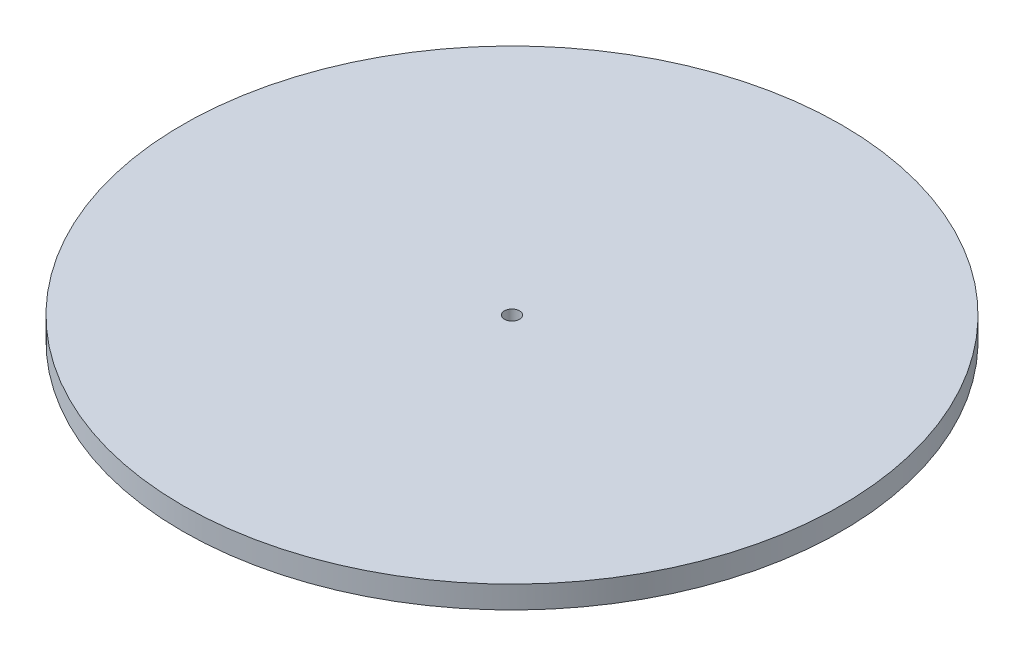
ISO-10303-21;
HEADER;
FILE_DESCRIPTION(('STEP AP214'),'2;1');
FILE_NAME('part.step','',(''),(''),'','','');
FILE_SCHEMA(('AUTOMOTIVE_DESIGN { 1 0 10303 214 1 1 1 1 }'));
ENDSEC;
DATA;
#1=APPLICATION_CONTEXT('core data for automotive mechanical design processes');
#2=APPLICATION_PROTOCOL_DEFINITION('international standard','automotive_design',2000,#1);
#3=PRODUCT_CONTEXT('',#1,'mechanical');
#4=PRODUCT('Part','Part','',(#3));
#5=PRODUCT_RELATED_PRODUCT_CATEGORY('part','',(#4));
#6=PRODUCT_DEFINITION_FORMATION('','',#4);
#7=PRODUCT_DEFINITION_CONTEXT('part definition',#1,'design');
#8=PRODUCT_DEFINITION('design','',#6,#7);
#9=PRODUCT_DEFINITION_SHAPE('','',#8);
#10=(LENGTH_UNIT() NAMED_UNIT(*) SI_UNIT(.MILLI.,.METRE.));
#11=(NAMED_UNIT(*) PLANE_ANGLE_UNIT() SI_UNIT($,.RADIAN.));
#12=(NAMED_UNIT(*) SI_UNIT($,.STERADIAN.) SOLID_ANGLE_UNIT());
#13=UNCERTAINTY_MEASURE_WITH_UNIT(LENGTH_MEASURE(1.E-05),#10,'distance_accuracy_value','');
#14=(GEOMETRIC_REPRESENTATION_CONTEXT(3) GLOBAL_UNCERTAINTY_ASSIGNED_CONTEXT((#13)) GLOBAL_UNIT_ASSIGNED_CONTEXT((#10,
#11,#12)) REPRESENTATION_CONTEXT('',''));
#15=CARTESIAN_POINT('',(0.,0.,0.));
#16=DIRECTION('',(0.,0.,1.));
#17=DIRECTION('',(1.,0.,0.));
#18=AXIS2_PLACEMENT_3D('',#15,#16,#17);
#19=CARTESIAN_POINT('',(0.,19.05,0.));
#20=DIRECTION('',(0.,-1.,0.));
#21=DIRECTION('',(0.,0.,-1.));
#22=AXIS2_PLACEMENT_3D('',#19,#20,#21);
#23=CYLINDRICAL_SURFACE('',#22,279.945595429);
#24=CARTESIAN_POINT('',(0.,19.05,0.));
#25=DIRECTION('',(0.,1.,0.));
#26=DIRECTION('',(0.,0.,1.));
#27=AXIS2_PLACEMENT_3D('',#24,#25,#26);
#28=CIRCLE('',#27,279.945595429);
#29=CARTESIAN_POINT('',(0.,19.05,-279.945595429));
#30=VERTEX_POINT('',#29);
#31=EDGE_CURVE('E10',#30,#30,#28,.T.);
#32=CARTESIAN_POINT('',(0.,0.,0.));
#33=DIRECTION('',(0.,1.,0.));
#34=DIRECTION('',(0.,0.,1.));
#35=AXIS2_PLACEMENT_3D('',#32,#33,#34);
#36=CIRCLE('',#35,279.945595429);
#37=CARTESIAN_POINT('',(0.,0.,-279.945595429));
#38=VERTEX_POINT('',#37);
#39=EDGE_CURVE('E37',#38,#38,#36,.T.);
#40=CARTESIAN_POINT('',(0.,19.05,-279.945595429));
#41=CARTESIAN_POINT('',(0.,18.8515625,-279.945595429));
#42=CARTESIAN_POINT('',(0.,18.653125,-279.945595429));
#43=CARTESIAN_POINT('',(0.,18.25625,-279.945595429));
#44=CARTESIAN_POINT('',(0.,18.0578125,-279.945595429));
#45=CARTESIAN_POINT('',(0.,17.6609375,-279.945595429));
#46=CARTESIAN_POINT('',(0.,17.4625,-279.945595429));
#47=CARTESIAN_POINT('',(0.,17.065625,-279.945595429));
#48=CARTESIAN_POINT('',(0.,16.8671875,-279.945595429));
#49=CARTESIAN_POINT('',(0.,16.4703125,-279.945595429));
#50=CARTESIAN_POINT('',(0.,16.271875,-279.945595429));
#51=CARTESIAN_POINT('',(0.,15.875,-279.945595429));
#52=CARTESIAN_POINT('',(0.,15.6765625,-279.945595429));
#53=CARTESIAN_POINT('',(0.,15.2796875,-279.945595429));
#54=CARTESIAN_POINT('',(0.,15.08125,-279.945595429));
#55=CARTESIAN_POINT('',(0.,14.684375,-279.945595429));
#56=CARTESIAN_POINT('',(0.,14.4859375,-279.945595429));
#57=CARTESIAN_POINT('',(0.,14.0890625,-279.945595429));
#58=CARTESIAN_POINT('',(0.,13.890625,-279.945595429));
#59=CARTESIAN_POINT('',(0.,13.49375,-279.945595429));
#60=CARTESIAN_POINT('',(0.,13.2953125,-279.945595429));
#61=CARTESIAN_POINT('',(0.,12.8984375,-279.945595429));
#62=CARTESIAN_POINT('',(0.,12.7,-279.945595429));
#63=CARTESIAN_POINT('',(0.,12.303125,-279.945595429));
#64=CARTESIAN_POINT('',(0.,12.1046875,-279.945595429));
#65=CARTESIAN_POINT('',(0.,11.7078125,-279.945595429));
#66=CARTESIAN_POINT('',(0.,11.509375,-279.945595429));
#67=CARTESIAN_POINT('',(0.,11.1125,-279.945595429));
#68=CARTESIAN_POINT('',(0.,10.9140625,-279.945595429));
#69=CARTESIAN_POINT('',(0.,10.5171875,-279.945595429));
#70=CARTESIAN_POINT('',(0.,10.31875,-279.945595429));
#71=CARTESIAN_POINT('',(0.,9.921875,-279.945595429));
#72=CARTESIAN_POINT('',(0.,9.7234375,-279.945595429));
#73=CARTESIAN_POINT('',(0.,9.3265625,-279.945595429));
#74=CARTESIAN_POINT('',(0.,9.128125,-279.945595429));
#75=CARTESIAN_POINT('',(0.,8.73125,-279.945595429));
#76=CARTESIAN_POINT('',(0.,8.5328125,-279.945595429));
#77=CARTESIAN_POINT('',(0.,8.1359375,-279.945595429));
#78=CARTESIAN_POINT('',(0.,7.9375,-279.945595429));
#79=CARTESIAN_POINT('',(0.,7.540625,-279.945595429));
#80=CARTESIAN_POINT('',(0.,7.3421875,-279.945595429));
#81=CARTESIAN_POINT('',(0.,6.9453125,-279.945595429));
#82=CARTESIAN_POINT('',(0.,6.746875,-279.945595429));
#83=CARTESIAN_POINT('',(0.,6.35,-279.945595429));
#84=CARTESIAN_POINT('',(0.,6.1515625,-279.945595429));
#85=CARTESIAN_POINT('',(0.,5.7546875,-279.945595429));
#86=CARTESIAN_POINT('',(0.,5.55625,-279.945595429));
#87=CARTESIAN_POINT('',(0.,5.159375,-279.945595429));
#88=CARTESIAN_POINT('',(0.,4.9609375,-279.945595429));
#89=CARTESIAN_POINT('',(0.,4.5640625,-279.945595429));
#90=CARTESIAN_POINT('',(0.,4.365625,-279.945595429));
#91=CARTESIAN_POINT('',(0.,3.96875,-279.945595429));
#92=CARTESIAN_POINT('',(0.,3.7703125,-279.945595429));
#93=CARTESIAN_POINT('',(0.,3.3734375,-279.945595429));
#94=CARTESIAN_POINT('',(0.,3.175,-279.945595429));
#95=CARTESIAN_POINT('',(0.,2.778125,-279.945595429));
#96=CARTESIAN_POINT('',(0.,2.5796875,-279.945595429));
#97=CARTESIAN_POINT('',(0.,2.1828125,-279.945595429));
#98=CARTESIAN_POINT('',(0.,1.984375,-279.945595429));
#99=CARTESIAN_POINT('',(0.,1.5875,-279.945595429));
#100=CARTESIAN_POINT('',(0.,1.3890625,-279.945595429));
#101=CARTESIAN_POINT('',(0.,0.992187500000001,-279.945595429));
#102=CARTESIAN_POINT('',(0.,0.793750000000001,-279.945595429));
#103=CARTESIAN_POINT('',(0.,0.396875,-279.945595429));
#104=CARTESIAN_POINT('',(0.,0.1984375,-279.945595429));
#105=CARTESIAN_POINT('',(0.,0.,-279.945595429));
#106=B_SPLINE_CURVE_WITH_KNOTS('',3,(#40,#41,#42,#43,#44,#45,#46,#47,#48,#49,#50,#51,#52,#53,
#54,#55,#56,#57,#58,#59,#60,#61,#62,#63,#64,#65,#66,#67,#68,#69,#70,#71,#72,#73,#74,#75,#76,#77,
#78,#79,#80,#81,#82,#83,#84,#85,#86,#87,#88,#89,#90,#91,#92,#93,#94,#95,#96,#97,#98,#99,#100,
#101,#102,#103,#104,#105),.UNSPECIFIED.,.F.,.F.,(4,2,2,2,2,2,2,2,2,2,2,2,2,2,2,2,2,2,2,2,2,2,2,
2,2,2,2,2,2,2,2,2,4),(0.,0.5953125,1.190625,1.7859375,2.38125,2.9765625,3.571875,4.1671875,
4.7625,5.3578125,5.953125,6.5484375,7.14375,7.7390625,8.334375,8.9296875,9.525,10.1203125,
10.715625,11.3109375,11.90625,12.5015625,13.096875,13.6921875,14.2875,14.8828125,15.478125,
16.0734375,16.66875,17.2640625,17.859375,18.4546875,19.05),.UNSPECIFIED.);
#107=EDGE_CURVE('BSEAM40',#30,#38,#106,.T.);
#108=ORIENTED_EDGE('',*,*,#31,.F.);
#109=ORIENTED_EDGE('',*,*,#39,.T.);
#110=ORIENTED_EDGE('',*,*,#107,.T.);
#111=ORIENTED_EDGE('',*,*,#107,.F.);
#112=EDGE_LOOP('',(#108,#110,#109,#111));
#113=FACE_BOUND('',#112,.T.);
#114=ADVANCED_FACE('F40',(#113),#23,.T.);
#115=CARTESIAN_POINT('',(0.,19.05,0.));
#116=DIRECTION('',(0.,1.,0.));
#117=DIRECTION('',(0.,0.,1.));
#118=AXIS2_PLACEMENT_3D('',#115,#116,#117);
#119=PLANE('',#118);
#120=CARTESIAN_POINT('',(0.,19.05,0.));
#121=DIRECTION('',(0.,1.,0.));
#122=DIRECTION('',(0.,0.,1.));
#123=AXIS2_PLACEMENT_3D('',#120,#121,#122);
#124=CIRCLE('',#123,6.35);
#125=CARTESIAN_POINT('',(0.,19.05,6.35));
#126=VERTEX_POINT('',#125);
#127=EDGE_CURVE('E51',#126,#126,#124,.T.);
#128=ORIENTED_EDGE('',*,*,#127,.F.);
#129=EDGE_LOOP('',(#128));
#130=FACE_BOUND('',#129,.T.);
#131=ORIENTED_EDGE('',*,*,#31,.T.);
#132=EDGE_LOOP('',(#131));
#133=FACE_BOUND('',#132,.T.);
#134=ADVANCED_FACE('F59',(#130,#133),#119,.T.);
#135=CARTESIAN_POINT('',(0.,0.,0.));
#136=DIRECTION('',(0.,1.,0.));
#137=DIRECTION('',(0.,0.,1.));
#138=AXIS2_PLACEMENT_3D('',#135,#136,#137);
#139=PLANE('',#138);
#140=CARTESIAN_POINT('',(0.,0.,0.));
#141=DIRECTION('',(0.,1.,0.));
#142=DIRECTION('',(0.,0.,1.));
#143=AXIS2_PLACEMENT_3D('',#140,#141,#142);
#144=CIRCLE('',#143,6.35);
#145=CARTESIAN_POINT('',(0.,0.,6.35));
#146=VERTEX_POINT('',#145);
#147=EDGE_CURVE('E50',#146,#146,#144,.F.);
#148=ORIENTED_EDGE('',*,*,#147,.F.);
#149=EDGE_LOOP('',(#148));
#150=FACE_BOUND('',#149,.T.);
#151=ORIENTED_EDGE('',*,*,#39,.F.);
#152=EDGE_LOOP('',(#151));
#153=FACE_BOUND('',#152,.T.);
#154=ADVANCED_FACE('F58',(#150,#153),#139,.F.);
#155=CARTESIAN_POINT('',(0.,-0.001000000000001,0.));
#156=DIRECTION('',(0.,1.,0.));
#157=DIRECTION('',(0.,0.,1.));
#158=AXIS2_PLACEMENT_3D('',#155,#156,#157);
#159=CYLINDRICAL_SURFACE('',#158,6.35);
#160=ORIENTED_EDGE('',*,*,#127,.T.);
#161=EDGE_LOOP('',(#160));
#162=FACE_BOUND('',#161,.T.);
#163=ORIENTED_EDGE('',*,*,#147,.T.);
#164=EDGE_LOOP('',(#163));
#165=FACE_BOUND('',#164,.T.);
#166=ADVANCED_FACE('F54',(#162,#165),#159,.F.);
#167=CLOSED_SHELL('',(#114,#134,#154,#166));
#168=MANIFOLD_SOLID_BREP('B2',#167);
#169=ADVANCED_BREP_SHAPE_REPRESENTATION('',(#18,#168),#14);
#170=SHAPE_DEFINITION_REPRESENTATION(#9,#169);
ENDSEC;
END-ISO-10303-21;
